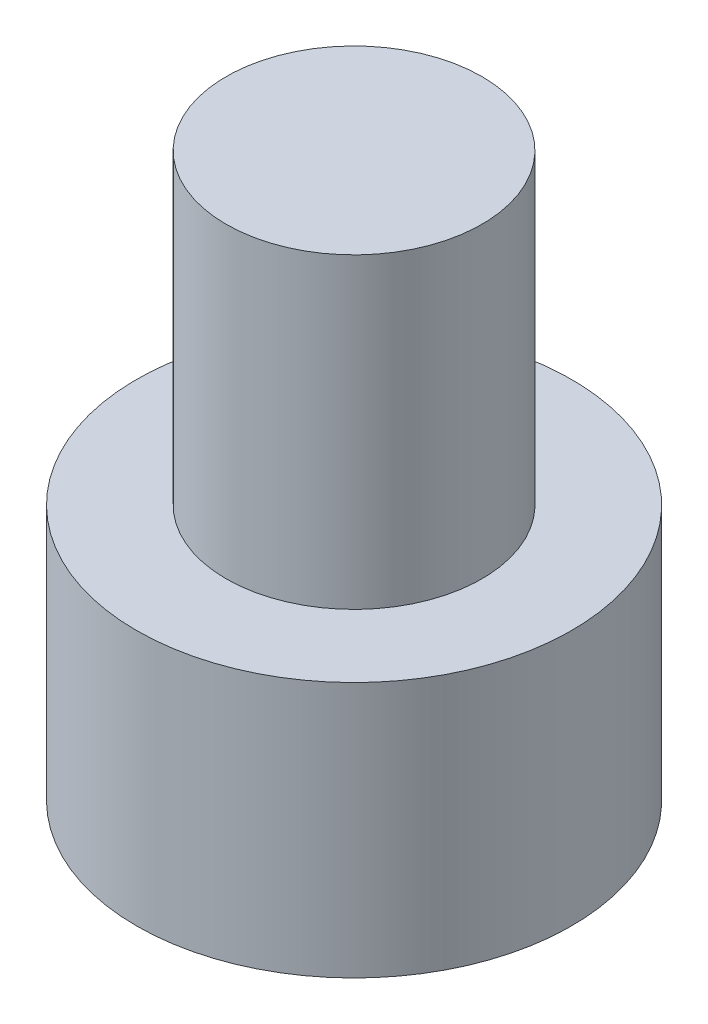
ISO-10303-21;
HEADER;
FILE_DESCRIPTION(('STEP AP214'),'2;1');
FILE_NAME('part.step','',(''),(''),'','','');
FILE_SCHEMA(('AUTOMOTIVE_DESIGN { 1 0 10303 214 1 1 1 1 }'));
ENDSEC;
DATA;
#1=APPLICATION_CONTEXT('core data for automotive mechanical design processes');
#2=APPLICATION_PROTOCOL_DEFINITION('international standard','automotive_design',2000,#1);
#3=PRODUCT_CONTEXT('',#1,'mechanical');
#4=PRODUCT('Part','Part','',(#3));
#5=PRODUCT_RELATED_PRODUCT_CATEGORY('part','',(#4));
#6=PRODUCT_DEFINITION_FORMATION('','',#4);
#7=PRODUCT_DEFINITION_CONTEXT('part definition',#1,'design');
#8=PRODUCT_DEFINITION('design','',#6,#7);
#9=PRODUCT_DEFINITION_SHAPE('','',#8);
#10=(LENGTH_UNIT() NAMED_UNIT(*) SI_UNIT(.MILLI.,.METRE.));
#11=(NAMED_UNIT(*) PLANE_ANGLE_UNIT() SI_UNIT($,.RADIAN.));
#12=(NAMED_UNIT(*) SI_UNIT($,.STERADIAN.) SOLID_ANGLE_UNIT());
#13=UNCERTAINTY_MEASURE_WITH_UNIT(LENGTH_MEASURE(1.E-05),#10,'distance_accuracy_value','');
#14=(GEOMETRIC_REPRESENTATION_CONTEXT(3) GLOBAL_UNCERTAINTY_ASSIGNED_CONTEXT((#13)) GLOBAL_UNIT_ASSIGNED_CONTEXT((#10,
#11,#12)) REPRESENTATION_CONTEXT('',''));
#15=CARTESIAN_POINT('',(0.,0.,0.));
#16=DIRECTION('',(0.,0.,1.));
#17=DIRECTION('',(1.,0.,0.));
#18=AXIS2_PLACEMENT_3D('',#15,#16,#17);
#19=CARTESIAN_POINT('',(0.,-5.,0.));
#20=DIRECTION('',(0.,1.,0.));
#21=DIRECTION('',(0.,0.,1.));
#22=AXIS2_PLACEMENT_3D('',#19,#20,#21);
#23=CYLINDRICAL_SURFACE('',#22,4.25);
#24=CARTESIAN_POINT('',(0.,-5.,0.));
#25=DIRECTION('',(0.,1.,0.));
#26=DIRECTION('',(0.,0.,1.));
#27=AXIS2_PLACEMENT_3D('',#24,#25,#26);
#28=CIRCLE('',#27,4.25);
#29=CARTESIAN_POINT('',(0.,-5.,4.25));
#30=VERTEX_POINT('',#29);
#31=EDGE_CURVE('E38',#30,#30,#28,.T.);
#32=ORIENTED_EDGE('',*,*,#31,.T.);
#33=EDGE_LOOP('',(#32));
#34=FACE_BOUND('',#33,.T.);
#35=CARTESIAN_POINT('',(0.,0.,0.));
#36=DIRECTION('',(0.,1.,0.));
#37=DIRECTION('',(0.,0.,1.));
#38=AXIS2_PLACEMENT_3D('',#35,#36,#37);
#39=CIRCLE('',#38,4.25);
#40=CARTESIAN_POINT('',(0.,0.,4.25));
#41=VERTEX_POINT('',#40);
#42=EDGE_CURVE('E144',#41,#41,#39,.T.);
#43=ORIENTED_EDGE('',*,*,#42,.F.);
#44=EDGE_LOOP('',(#43));
#45=FACE_BOUND('',#44,.T.);
#46=ADVANCED_FACE('F35',(#34,#45),#23,.T.);
#47=CARTESIAN_POINT('',(4.25,-5.,0.));
#48=DIRECTION('',(0.,-1.,0.));
#49=DIRECTION('',(0.,0.,-1.));
#50=AXIS2_PLACEMENT_3D('',#47,#48,#49);
#51=PLANE('',#50);
#52=DIRECTION('',(0.500000000000001,0.,-0.866025403784438));
#53=VECTOR('',#52,1.);
#54=CARTESIAN_POINT('',(-2.30940107675851,-5.,0.));
#55=LINE('',#54,#53);
#56=CARTESIAN_POINT('',(-2.30940107675851,-5.,0.));
#57=VERTEX_POINT('',#56);
#58=CARTESIAN_POINT('',(-1.15470053837925,-5.,-2.));
#59=VERTEX_POINT('',#58);
#60=EDGE_CURVE('E50',#57,#59,#55,.T.);
#61=ORIENTED_EDGE('',*,*,#60,.F.);
#62=DIRECTION('',(-0.500000000000001,0.,-0.866025403784438));
#63=VECTOR('',#62,1.);
#64=CARTESIAN_POINT('',(-1.15470053837925,-5.,2.));
#65=LINE('',#64,#63);
#66=CARTESIAN_POINT('',(-1.15470053837925,-5.,2.));
#67=VERTEX_POINT('',#66);
#68=EDGE_CURVE('E133',#67,#57,#65,.T.);
#69=ORIENTED_EDGE('',*,*,#68,.F.);
#70=DIRECTION('',(-1.,0.,0.));
#71=VECTOR('',#70,1.);
#72=CARTESIAN_POINT('',(1.15470053837925,-5.,2.));
#73=LINE('',#72,#71);
#74=CARTESIAN_POINT('',(1.15470053837925,-5.,2.));
#75=VERTEX_POINT('',#74);
#76=EDGE_CURVE('E131',#75,#67,#73,.T.);
#77=ORIENTED_EDGE('',*,*,#76,.F.);
#78=DIRECTION('',(-0.500000000000001,0.,0.866025403784438));
#79=VECTOR('',#78,1.);
#80=CARTESIAN_POINT('',(2.30940107675851,-5.,0.));
#81=LINE('',#80,#79);
#82=CARTESIAN_POINT('',(2.30940107675851,-5.,0.));
#83=VERTEX_POINT('',#82);
#84=EDGE_CURVE('E98',#83,#75,#81,.T.);
#85=ORIENTED_EDGE('',*,*,#84,.F.);
#86=DIRECTION('',(0.500000000000001,0.,0.866025403784438));
#87=VECTOR('',#86,1.);
#88=CARTESIAN_POINT('',(1.15470053837925,-5.,-2.));
#89=LINE('',#88,#87);
#90=CARTESIAN_POINT('',(1.15470053837925,-5.,-2.));
#91=VERTEX_POINT('',#90);
#92=EDGE_CURVE('E127',#91,#83,#89,.T.);
#93=ORIENTED_EDGE('',*,*,#92,.F.);
#94=DIRECTION('',(1.,0.,0.));
#95=VECTOR('',#94,1.);
#96=CARTESIAN_POINT('',(-1.15470053837925,-5.,-2.));
#97=LINE('',#96,#95);
#98=EDGE_CURVE('E124',#59,#91,#97,.T.);
#99=ORIENTED_EDGE('',*,*,#98,.F.);
#100=EDGE_LOOP('',(#61,#69,#77,#85,#93,#99));
#101=FACE_BOUND('',#100,.T.);
#102=ORIENTED_EDGE('',*,*,#31,.F.);
#103=EDGE_LOOP('',(#102));
#104=FACE_BOUND('',#103,.T.);
#105=ADVANCED_FACE('F153',(#101,#104),#51,.T.);
#106=CARTESIAN_POINT('',(0.,0.,0.));
#107=DIRECTION('',(0.,1.,0.));
#108=DIRECTION('',(0.,0.,1.));
#109=AXIS2_PLACEMENT_3D('',#106,#107,#108);
#110=PLANE('',#109);
#111=CARTESIAN_POINT('',(0.,0.,0.));
#112=DIRECTION('',(0.,1.,0.));
#113=DIRECTION('',(0.,0.,1.));
#114=AXIS2_PLACEMENT_3D('',#111,#112,#113);
#115=CIRCLE('',#114,2.5);
#116=CARTESIAN_POINT('',(0.,0.,2.5));
#117=VERTEX_POINT('',#116);
#118=EDGE_CURVE('E11',#117,#117,#115,.T.);
#119=ORIENTED_EDGE('',*,*,#118,.F.);
#120=EDGE_LOOP('',(#119));
#121=FACE_BOUND('',#120,.T.);
#122=ORIENTED_EDGE('',*,*,#42,.T.);
#123=EDGE_LOOP('',(#122));
#124=FACE_BOUND('',#123,.T.);
#125=ADVANCED_FACE('F155',(#121,#124),#110,.T.);
#126=CARTESIAN_POINT('',(0.,6.,0.));
#127=DIRECTION('',(0.,-1.,0.));
#128=DIRECTION('',(0.,0.,-1.));
#129=AXIS2_PLACEMENT_3D('',#126,#127,#128);
#130=CYLINDRICAL_SURFACE('',#129,2.5);
#131=CARTESIAN_POINT('',(0.,6.,0.));
#132=DIRECTION('',(0.,1.,0.));
#133=DIRECTION('',(0.,0.,1.));
#134=AXIS2_PLACEMENT_3D('',#131,#132,#133);
#135=CIRCLE('',#134,2.5);
#136=CARTESIAN_POINT('',(0.,6.,2.5));
#137=VERTEX_POINT('',#136);
#138=EDGE_CURVE('E137',#137,#137,#135,.T.);
#139=ORIENTED_EDGE('',*,*,#138,.F.);
#140=EDGE_LOOP('',(#139));
#141=FACE_BOUND('',#140,.T.);
#142=ORIENTED_EDGE('',*,*,#118,.T.);
#143=EDGE_LOOP('',(#142));
#144=FACE_BOUND('',#143,.T.);
#145=ADVANCED_FACE('F161',(#141,#144),#130,.T.);
#146=CARTESIAN_POINT('',(0.,6.,0.));
#147=DIRECTION('',(0.,1.,0.));
#148=DIRECTION('',(0.,0.,1.));
#149=AXIS2_PLACEMENT_3D('',#146,#147,#148);
#150=PLANE('',#149);
#151=ORIENTED_EDGE('',*,*,#138,.T.);
#152=EDGE_LOOP('',(#151));
#153=FACE_BOUND('',#152,.T.);
#154=ADVANCED_FACE('F167',(#153),#150,.T.);
#155=CARTESIAN_POINT('',(-2.30940107675851,-4.,0.));
#156=DIRECTION('',(-0.866025403784438,0.,-0.500000000000001));
#157=DIRECTION('',(-0.500000000000001,0.,0.866025403784438));
#158=AXIS2_PLACEMENT_3D('',#155,#156,#157);
#159=PLANE('',#158);
#160=ORIENTED_EDGE('',*,*,#60,.T.);
#161=DIRECTION('',(0.,-1.,0.));
#162=VECTOR('',#161,1.);
#163=CARTESIAN_POINT('',(-1.15470053837925,-4.,-2.));
#164=LINE('',#163,#162);
#165=CARTESIAN_POINT('',(-1.15470053837925,-4.,-2.));
#166=VERTEX_POINT('',#165);
#167=EDGE_CURVE('E80',#166,#59,#164,.T.);
#168=ORIENTED_EDGE('',*,*,#167,.F.);
#169=DIRECTION('',(0.500000000000001,0.,-0.866025403784438));
#170=VECTOR('',#169,1.);
#171=CARTESIAN_POINT('',(-2.30940107675851,-4.,0.));
#172=LINE('',#171,#170);
#173=CARTESIAN_POINT('',(-2.30940107675851,-4.,0.));
#174=VERTEX_POINT('',#173);
#175=EDGE_CURVE('E135',#174,#166,#172,.T.);
#176=ORIENTED_EDGE('',*,*,#175,.F.);
#177=DIRECTION('',(0.,-1.,0.));
#178=VECTOR('',#177,1.);
#179=CARTESIAN_POINT('',(-2.30940107675851,-4.,0.));
#180=LINE('',#179,#178);
#181=EDGE_CURVE('E58',#174,#57,#180,.T.);
#182=ORIENTED_EDGE('',*,*,#181,.T.);
#183=EDGE_LOOP('',(#160,#168,#176,#182));
#184=FACE_BOUND('',#183,.T.);
#185=ADVANCED_FACE('F171',(#184),#159,.F.);
#186=CARTESIAN_POINT('',(-1.15470053837925,-4.,2.));
#187=DIRECTION('',(-0.866025403784438,0.,0.500000000000001));
#188=DIRECTION('',(0.500000000000001,0.,0.866025403784438));
#189=AXIS2_PLACEMENT_3D('',#186,#187,#188);
#190=PLANE('',#189);
#191=ORIENTED_EDGE('',*,*,#68,.T.);
#192=ORIENTED_EDGE('',*,*,#181,.F.);
#193=DIRECTION('',(-0.500000000000001,0.,-0.866025403784438));
#194=VECTOR('',#193,1.);
#195=CARTESIAN_POINT('',(-1.15470053837925,-4.,2.));
#196=LINE('',#195,#194);
#197=CARTESIAN_POINT('',(-1.15470053837925,-4.,2.));
#198=VERTEX_POINT('',#197);
#199=EDGE_CURVE('E110',#198,#174,#196,.T.);
#200=ORIENTED_EDGE('',*,*,#199,.F.);
#201=DIRECTION('',(0.,-1.,0.));
#202=VECTOR('',#201,1.);
#203=CARTESIAN_POINT('',(-1.15470053837925,-4.,2.));
#204=LINE('',#203,#202);
#205=EDGE_CURVE('E102',#198,#67,#204,.T.);
#206=ORIENTED_EDGE('',*,*,#205,.T.);
#207=EDGE_LOOP('',(#191,#192,#200,#206));
#208=FACE_BOUND('',#207,.T.);
#209=ADVANCED_FACE('F175',(#208),#190,.F.);
#210=CARTESIAN_POINT('',(1.15470053837925,-4.,2.));
#211=DIRECTION('',(0.,0.,1.));
#212=DIRECTION('',(1.,0.,0.));
#213=AXIS2_PLACEMENT_3D('',#210,#211,#212);
#214=PLANE('',#213);
#215=ORIENTED_EDGE('',*,*,#76,.T.);
#216=ORIENTED_EDGE('',*,*,#205,.F.);
#217=DIRECTION('',(-1.,0.,0.));
#218=VECTOR('',#217,1.);
#219=CARTESIAN_POINT('',(1.15470053837925,-4.,2.));
#220=LINE('',#219,#218);
#221=CARTESIAN_POINT('',(1.15470053837925,-4.,2.));
#222=VERTEX_POINT('',#221);
#223=EDGE_CURVE('E106',#222,#198,#220,.T.);
#224=ORIENTED_EDGE('',*,*,#223,.F.);
#225=DIRECTION('',(0.,-1.,0.));
#226=VECTOR('',#225,1.);
#227=CARTESIAN_POINT('',(1.15470053837925,-4.,2.));
#228=LINE('',#227,#226);
#229=EDGE_CURVE('E91',#222,#75,#228,.T.);
#230=ORIENTED_EDGE('',*,*,#229,.T.);
#231=EDGE_LOOP('',(#215,#216,#224,#230));
#232=FACE_BOUND('',#231,.T.);
#233=ADVANCED_FACE('F107',(#232),#214,.F.);
#234=CARTESIAN_POINT('',(2.30940107675851,-4.,0.));
#235=DIRECTION('',(0.866025403784438,0.,0.500000000000001));
#236=DIRECTION('',(0.500000000000001,0.,-0.866025403784438));
#237=AXIS2_PLACEMENT_3D('',#234,#235,#236);
#238=PLANE('',#237);
#239=ORIENTED_EDGE('',*,*,#84,.T.);
#240=ORIENTED_EDGE('',*,*,#229,.F.);
#241=DIRECTION('',(-0.500000000000001,0.,0.866025403784438));
#242=VECTOR('',#241,1.);
#243=CARTESIAN_POINT('',(2.30940107675851,-4.,0.));
#244=LINE('',#243,#242);
#245=CARTESIAN_POINT('',(2.30940107675851,-4.,0.));
#246=VERTEX_POINT('',#245);
#247=EDGE_CURVE('E95',#246,#222,#244,.T.);
#248=ORIENTED_EDGE('',*,*,#247,.F.);
#249=DIRECTION('',(0.,-1.,0.));
#250=VECTOR('',#249,1.);
#251=CARTESIAN_POINT('',(2.30940107675851,-4.,0.));
#252=LINE('',#251,#250);
#253=EDGE_CURVE('E103',#246,#83,#252,.T.);
#254=ORIENTED_EDGE('',*,*,#253,.T.);
#255=EDGE_LOOP('',(#239,#240,#248,#254));
#256=FACE_BOUND('',#255,.T.);
#257=ADVANCED_FACE('F93',(#256),#238,.F.);
#258=CARTESIAN_POINT('',(1.15470053837925,-4.,-2.));
#259=DIRECTION('',(0.866025403784438,0.,-0.500000000000001));
#260=DIRECTION('',(-0.500000000000001,0.,-0.866025403784438));
#261=AXIS2_PLACEMENT_3D('',#258,#259,#260);
#262=PLANE('',#261);
#263=ORIENTED_EDGE('',*,*,#92,.T.);
#264=ORIENTED_EDGE('',*,*,#253,.F.);
#265=DIRECTION('',(0.500000000000001,0.,0.866025403784438));
#266=VECTOR('',#265,1.);
#267=CARTESIAN_POINT('',(1.15470053837925,-4.,-2.));
#268=LINE('',#267,#266);
#269=CARTESIAN_POINT('',(1.15470053837925,-4.,-2.));
#270=VERTEX_POINT('',#269);
#271=EDGE_CURVE('E116',#270,#246,#268,.T.);
#272=ORIENTED_EDGE('',*,*,#271,.F.);
#273=DIRECTION('',(0.,-1.,0.));
#274=VECTOR('',#273,1.);
#275=CARTESIAN_POINT('',(1.15470053837925,-4.,-2.));
#276=LINE('',#275,#274);
#277=EDGE_CURVE('E140',#270,#91,#276,.T.);
#278=ORIENTED_EDGE('',*,*,#277,.T.);
#279=EDGE_LOOP('',(#263,#264,#272,#278));
#280=FACE_BOUND('',#279,.T.);
#281=ADVANCED_FACE('F179',(#280),#262,.F.);
#282=CARTESIAN_POINT('',(-1.15470053837925,-4.,-2.));
#283=DIRECTION('',(0.,0.,-1.));
#284=DIRECTION('',(-1.,0.,0.));
#285=AXIS2_PLACEMENT_3D('',#282,#283,#284);
#286=PLANE('',#285);
#287=ORIENTED_EDGE('',*,*,#98,.T.);
#288=ORIENTED_EDGE('',*,*,#277,.F.);
#289=DIRECTION('',(1.,0.,0.));
#290=VECTOR('',#289,1.);
#291=CARTESIAN_POINT('',(-1.15470053837925,-4.,-2.));
#292=LINE('',#291,#290);
#293=EDGE_CURVE('E118',#166,#270,#292,.T.);
#294=ORIENTED_EDGE('',*,*,#293,.F.);
#295=ORIENTED_EDGE('',*,*,#167,.T.);
#296=EDGE_LOOP('',(#287,#288,#294,#295));
#297=FACE_BOUND('',#296,.T.);
#298=ADVANCED_FACE('F176',(#297),#286,.F.);
#299=CARTESIAN_POINT('',(0.,-4.,0.));
#300=DIRECTION('',(0.,-1.,0.));
#301=DIRECTION('',(0.,0.,-1.));
#302=AXIS2_PLACEMENT_3D('',#299,#300,#301);
#303=PLANE('',#302);
#304=ORIENTED_EDGE('',*,*,#175,.T.);
#305=ORIENTED_EDGE('',*,*,#293,.T.);
#306=ORIENTED_EDGE('',*,*,#271,.T.);
#307=ORIENTED_EDGE('',*,*,#247,.T.);
#308=ORIENTED_EDGE('',*,*,#223,.T.);
#309=ORIENTED_EDGE('',*,*,#199,.T.);
#310=EDGE_LOOP('',(#304,#305,#306,#307,#308,#309));
#311=FACE_BOUND('',#310,.T.);
#312=ADVANCED_FACE('F113',(#311),#303,.T.);
#313=CLOSED_SHELL('',(#46,#105,#125,#145,#154,#185,#209,#233,#257,#281,#298,#312));
#314=MANIFOLD_SOLID_BREP('B2',#313);
#315=ADVANCED_BREP_SHAPE_REPRESENTATION('',(#18,#314),#14);
#316=SHAPE_DEFINITION_REPRESENTATION(#9,#315);
ENDSEC;
END-ISO-10303-21;
